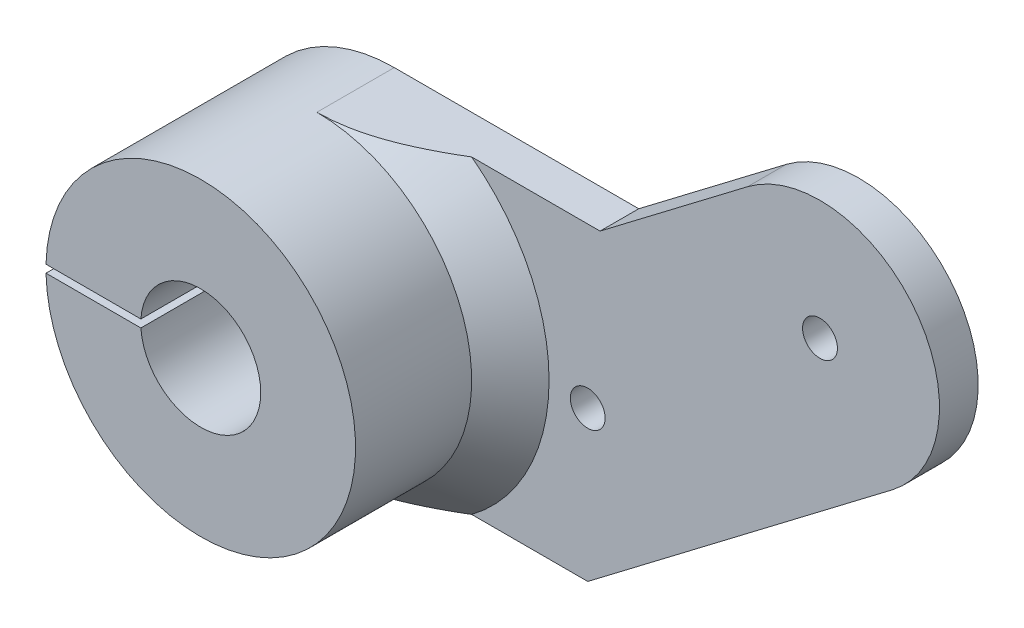
ISO-10303-21;
HEADER;
FILE_DESCRIPTION(('STEP AP214'),'2;1');
FILE_NAME('part.step','',(''),(''),'','','');
FILE_SCHEMA(('AUTOMOTIVE_DESIGN { 1 0 10303 214 1 1 1 1 }'));
ENDSEC;
DATA;
#1=APPLICATION_CONTEXT('core data for automotive mechanical design processes');
#2=APPLICATION_PROTOCOL_DEFINITION('international standard','automotive_design',2000,#1);
#3=PRODUCT_CONTEXT('',#1,'mechanical');
#4=PRODUCT('Part','Part','',(#3));
#5=PRODUCT_RELATED_PRODUCT_CATEGORY('part','',(#4));
#6=PRODUCT_DEFINITION_FORMATION('','',#4);
#7=PRODUCT_DEFINITION_CONTEXT('part definition',#1,'design');
#8=PRODUCT_DEFINITION('design','',#6,#7);
#9=PRODUCT_DEFINITION_SHAPE('','',#8);
#10=(LENGTH_UNIT() NAMED_UNIT(*) SI_UNIT(.MILLI.,.METRE.));
#11=(NAMED_UNIT(*) PLANE_ANGLE_UNIT() SI_UNIT($,.RADIAN.));
#12=(NAMED_UNIT(*) SI_UNIT($,.STERADIAN.) SOLID_ANGLE_UNIT());
#13=UNCERTAINTY_MEASURE_WITH_UNIT(LENGTH_MEASURE(1.E-05),#10,'distance_accuracy_value','');
#14=(GEOMETRIC_REPRESENTATION_CONTEXT(3) GLOBAL_UNCERTAINTY_ASSIGNED_CONTEXT((#13)) GLOBAL_UNIT_ASSIGNED_CONTEXT((#10,
#11,#12)) REPRESENTATION_CONTEXT('',''));
#15=CARTESIAN_POINT('',(0.,0.,0.));
#16=DIRECTION('',(0.,0.,1.));
#17=DIRECTION('',(1.,0.,0.));
#18=AXIS2_PLACEMENT_3D('',#15,#16,#17);
#19=CARTESIAN_POINT('',(0.,0.,5.));
#20=DIRECTION('',(0.,0.,1.));
#21=DIRECTION('',(1.,0.,0.));
#22=AXIS2_PLACEMENT_3D('',#19,#20,#21);
#23=PLANE('',#22);
#24=DIRECTION('',(-1.,0.,0.));
#25=VECTOR('',#24,1.);
#26=CARTESIAN_POINT('',(0.,20.,5.));
#27=LINE('',#26,#25);
#28=CARTESIAN_POINT('',(31.5884611738769,20.,5.));
#29=VERTEX_POINT('',#28);
#30=CARTESIAN_POINT('',(14.9999999999999,20.,5.));
#31=VERTEX_POINT('',#30);
#32=EDGE_CURVE('E175',#29,#31,#27,.T.);
#33=ORIENTED_EDGE('',*,*,#32,.T.);
#34=CARTESIAN_POINT('',(0.,0.,5.));
#35=DIRECTION('',(0.,0.,1.));
#36=DIRECTION('',(1.,0.,0.));
#37=AXIS2_PLACEMENT_3D('',#34,#35,#36);
#38=CIRCLE('',#37,25.);
#39=CARTESIAN_POINT('',(14.9999999999999,-20.,5.));
#40=VERTEX_POINT('',#39);
#41=EDGE_CURVE('E59',#31,#40,#38,.F.);
#42=ORIENTED_EDGE('',*,*,#41,.T.);
#43=DIRECTION('',(1.,0.,0.));
#44=VECTOR('',#43,1.);
#45=CARTESIAN_POINT('',(30.,-20.,5.));
#46=LINE('',#45,#44);
#47=CARTESIAN_POINT('',(30.,-20.,5.));
#48=VERTEX_POINT('',#47);
#49=EDGE_CURVE('E166',#40,#48,#46,.T.);
#50=ORIENTED_EDGE('',*,*,#49,.T.);
#51=DIRECTION('',(0.795919846865735,0.605402013017156,0.));
#52=VECTOR('',#51,1.);
#53=CARTESIAN_POINT('',(69.3459347940942,9.92777252909064,5.));
#54=LINE('',#53,#52);
#55=CARTESIAN_POINT('',(69.3459347940942,9.92777252909065,5.));
#56=VERTEX_POINT('',#55);
#57=EDGE_CURVE('E168',#48,#56,#54,.T.);
#58=ORIENTED_EDGE('',*,*,#57,.T.);
#59=CARTESIAN_POINT('',(59.9999999653329,22.2148393999999,5.));
#60=DIRECTION('',(0.,0.,1.));
#61=DIRECTION('',(-1.,0.,0.));
#62=AXIS2_PLACEMENT_3D('',#59,#60,#61);
#63=CIRCLE('',#62,15.4375681411824);
#64=CARTESIAN_POINT('',(50.6540651365716,34.5019062709091,5.));
#65=VERTEX_POINT('',#64);
#66=EDGE_CURVE('E171',#56,#65,#63,.T.);
#67=ORIENTED_EDGE('',*,*,#66,.T.);
#68=DIRECTION('',(-0.795919846865736,-0.605402013017156,0.));
#69=VECTOR('',#68,1.);
#70=CARTESIAN_POINT('',(31.5884611738769,20.,5.));
#71=LINE('',#70,#69);
#72=EDGE_CURVE('E173',#65,#29,#71,.T.);
#73=ORIENTED_EDGE('',*,*,#72,.T.);
#74=EDGE_LOOP('',(#33,#42,#50,#58,#67,#73));
#75=FACE_BOUND('',#74,.T.);
#76=CARTESIAN_POINT('',(29.9938217384947,-0.608816490746889,5.));
#77=DIRECTION('',(0.,0.,1.));
#78=DIRECTION('',(1.,0.,0.));
#79=AXIS2_PLACEMENT_3D('',#76,#77,#78);
#80=CIRCLE('',#79,2.25000000000001);
#81=CARTESIAN_POINT('',(32.2438217384947,-0.608816490746889,5.));
#82=VERTEX_POINT('',#81);
#83=EDGE_CURVE('E160',#82,#82,#80,.T.);
#84=ORIENTED_EDGE('',*,*,#83,.F.);
#85=EDGE_LOOP('',(#84));
#86=FACE_BOUND('',#85,.T.);
#87=CARTESIAN_POINT('',(59.9999999653329,22.2148393999999,5.));
#88=DIRECTION('',(0.,0.,1.));
#89=DIRECTION('',(1.,0.,0.));
#90=AXIS2_PLACEMENT_3D('',#87,#88,#89);
#91=CIRCLE('',#90,2.24999999999999);
#92=CARTESIAN_POINT('',(62.2499999653329,22.2148393999999,5.));
#93=VERTEX_POINT('',#92);
#94=EDGE_CURVE('E154',#93,#93,#91,.T.);
#95=ORIENTED_EDGE('',*,*,#94,.F.);
#96=EDGE_LOOP('',(#95));
#97=FACE_BOUND('',#96,.T.);
#98=ADVANCED_FACE('F33',(#75,#86,#97),#23,.T.);
#99=CARTESIAN_POINT('',(0.,0.,0.));
#100=DIRECTION('',(0.,0.,1.));
#101=DIRECTION('',(1.,0.,0.));
#102=AXIS2_PLACEMENT_3D('',#99,#100,#101);
#103=PLANE('',#102);
#104=CARTESIAN_POINT('',(0.,0.,0.));
#105=DIRECTION('',(0.,0.,-1.));
#106=DIRECTION('',(1.,0.,0.));
#107=AXIS2_PLACEMENT_3D('',#104,#105,#106);
#108=CIRCLE('',#107,7.75);
#109=CARTESIAN_POINT('',(-7.73385414912901,0.499999999999999,0.));
#110=VERTEX_POINT('',#109);
#111=CARTESIAN_POINT('',(-7.73385414912901,-0.500000000000001,0.));
#112=VERTEX_POINT('',#111);
#113=EDGE_CURVE('E163',#110,#112,#108,.T.);
#114=ORIENTED_EDGE('',*,*,#113,.F.);
#115=DIRECTION('',(1.,0.,0.));
#116=VECTOR('',#115,1.);
#117=CARTESIAN_POINT('',(-7.73385414912901,0.499999999999999,0.));
#118=LINE('',#117,#116);
#119=CARTESIAN_POINT('',(-19.9937490231322,0.499999999999997,0.));
#120=VERTEX_POINT('',#119);
#121=EDGE_CURVE('E169',#120,#110,#118,.T.);
#122=ORIENTED_EDGE('',*,*,#121,.F.);
#123=CARTESIAN_POINT('',(0.,0.,0.));
#124=DIRECTION('',(0.,0.,1.));
#125=DIRECTION('',(1.,0.,0.));
#126=AXIS2_PLACEMENT_3D('',#123,#124,#125);
#127=CIRCLE('',#126,20.);
#128=CARTESIAN_POINT('',(0.,20.,0.));
#129=VERTEX_POINT('',#128);
#130=EDGE_CURVE('E131',#129,#120,#127,.T.);
#131=ORIENTED_EDGE('',*,*,#130,.F.);
#132=DIRECTION('',(-1.,0.,0.));
#133=VECTOR('',#132,1.);
#134=CARTESIAN_POINT('',(0.,20.,0.));
#135=LINE('',#134,#133);
#136=CARTESIAN_POINT('',(31.5884611738769,20.,0.));
#137=VERTEX_POINT('',#136);
#138=EDGE_CURVE('E191',#137,#129,#135,.T.);
#139=ORIENTED_EDGE('',*,*,#138,.F.);
#140=DIRECTION('',(-0.795919846865736,-0.605402013017156,0.));
#141=VECTOR('',#140,1.);
#142=CARTESIAN_POINT('',(31.5884611738769,20.,0.));
#143=LINE('',#142,#141);
#144=CARTESIAN_POINT('',(50.6540651365716,34.5019062709091,0.));
#145=VERTEX_POINT('',#144);
#146=EDGE_CURVE('E189',#145,#137,#143,.T.);
#147=ORIENTED_EDGE('',*,*,#146,.F.);
#148=CARTESIAN_POINT('',(59.9999999653329,22.2148393999999,0.));
#149=DIRECTION('',(0.,0.,1.));
#150=DIRECTION('',(-1.,0.,0.));
#151=AXIS2_PLACEMENT_3D('',#148,#149,#150);
#152=CIRCLE('',#151,15.4375681411824);
#153=CARTESIAN_POINT('',(69.3459347940942,9.92777252909065,0.));
#154=VERTEX_POINT('',#153);
#155=EDGE_CURVE('E187',#154,#145,#152,.T.);
#156=ORIENTED_EDGE('',*,*,#155,.F.);
#157=DIRECTION('',(0.795919846865735,0.605402013017156,0.));
#158=VECTOR('',#157,1.);
#159=CARTESIAN_POINT('',(69.3459347940942,9.92777252909064,0.));
#160=LINE('',#159,#158);
#161=CARTESIAN_POINT('',(30.,-20.,0.));
#162=VERTEX_POINT('',#161);
#163=EDGE_CURVE('E185',#162,#154,#160,.T.);
#164=ORIENTED_EDGE('',*,*,#163,.F.);
#165=DIRECTION('',(1.,0.,0.));
#166=VECTOR('',#165,1.);
#167=CARTESIAN_POINT('',(30.,-20.,0.));
#168=LINE('',#167,#166);
#169=CARTESIAN_POINT('',(0.,-20.,0.));
#170=VERTEX_POINT('',#169);
#171=EDGE_CURVE('E183',#170,#162,#168,.T.);
#172=ORIENTED_EDGE('',*,*,#171,.F.);
#173=CARTESIAN_POINT('',(0.,0.,0.));
#174=DIRECTION('',(0.,0.,1.));
#175=DIRECTION('',(1.,0.,0.));
#176=AXIS2_PLACEMENT_3D('',#173,#174,#175);
#177=CIRCLE('',#176,20.);
#178=CARTESIAN_POINT('',(-19.9937490231322,-0.499999999999995,0.));
#179=VERTEX_POINT('',#178);
#180=EDGE_CURVE('E181',#179,#170,#177,.T.);
#181=ORIENTED_EDGE('',*,*,#180,.F.);
#182=DIRECTION('',(-1.,0.,0.));
#183=VECTOR('',#182,1.);
#184=CARTESIAN_POINT('',(-7.73385414912901,-0.500000000000001,0.));
#185=LINE('',#184,#183);
#186=EDGE_CURVE('E179',#112,#179,#185,.T.);
#187=ORIENTED_EDGE('',*,*,#186,.F.);
#188=EDGE_LOOP('',(#114,#122,#131,#139,#147,#156,#164,#172,#181,#187));
#189=FACE_BOUND('',#188,.T.);
#190=CARTESIAN_POINT('',(29.9938217384947,-0.608816490746889,0.));
#191=DIRECTION('',(0.,0.,1.));
#192=DIRECTION('',(1.,0.,0.));
#193=AXIS2_PLACEMENT_3D('',#190,#191,#192);
#194=CIRCLE('',#193,2.25000000000001);
#195=CARTESIAN_POINT('',(32.2438217384947,-0.608816490746889,0.));
#196=VERTEX_POINT('',#195);
#197=EDGE_CURVE('E157',#196,#196,#194,.T.);
#198=ORIENTED_EDGE('',*,*,#197,.T.);
#199=EDGE_LOOP('',(#198));
#200=FACE_BOUND('',#199,.T.);
#201=CARTESIAN_POINT('',(59.9999999653329,22.2148393999999,0.));
#202=DIRECTION('',(0.,0.,1.));
#203=DIRECTION('',(1.,0.,0.));
#204=AXIS2_PLACEMENT_3D('',#201,#202,#203);
#205=CIRCLE('',#204,2.24999999999999);
#206=CARTESIAN_POINT('',(62.2499999653329,22.2148393999999,0.));
#207=VERTEX_POINT('',#206);
#208=EDGE_CURVE('E153',#207,#207,#205,.T.);
#209=ORIENTED_EDGE('',*,*,#208,.T.);
#210=EDGE_LOOP('',(#209));
#211=FACE_BOUND('',#210,.T.);
#212=ADVANCED_FACE('F250',(#189,#200,#211),#103,.F.);
#213=CARTESIAN_POINT('',(0.,0.,5.));
#214=DIRECTION('',(0.,0.,-1.));
#215=DIRECTION('',(-1.,0.,0.));
#216=AXIS2_PLACEMENT_3D('',#213,#214,#215);
#217=CYLINDRICAL_SURFACE('',#216,7.75);
#218=ORIENTED_EDGE('',*,*,#113,.T.);
#219=DIRECTION('',(0.,0.,-1.));
#220=VECTOR('',#219,1.);
#221=CARTESIAN_POINT('',(-7.73385414912901,-0.500000000000001,5.));
#222=LINE('',#221,#220);
#223=CARTESIAN_POINT('',(-7.73385414912901,-0.5,25.));
#224=VERTEX_POINT('',#223);
#225=EDGE_CURVE('E214',#224,#112,#222,.T.);
#226=ORIENTED_EDGE('',*,*,#225,.F.);
#227=CARTESIAN_POINT('',(0.,0.,25.));
#228=DIRECTION('',(0.,0.,-1.));
#229=DIRECTION('',(1.,0.,0.));
#230=AXIS2_PLACEMENT_3D('',#227,#228,#229);
#231=CIRCLE('',#230,7.75);
#232=CARTESIAN_POINT('',(-7.73385414912901,0.499999999999995,25.));
#233=VERTEX_POINT('',#232);
#234=EDGE_CURVE('E144',#233,#224,#231,.T.);
#235=ORIENTED_EDGE('',*,*,#234,.F.);
#236=DIRECTION('',(0.,0.,-1.));
#237=VECTOR('',#236,1.);
#238=CARTESIAN_POINT('',(-7.73385414912901,0.499999999999999,5.));
#239=LINE('',#238,#237);
#240=EDGE_CURVE('E135',#233,#110,#239,.T.);
#241=ORIENTED_EDGE('',*,*,#240,.T.);
#242=EDGE_LOOP('',(#218,#226,#235,#241));
#243=FACE_BOUND('',#242,.T.);
#244=ADVANCED_FACE('F247',(#243),#217,.F.);
#245=CARTESIAN_POINT('',(-7.73385414912901,-0.500000000000001,5.));
#246=DIRECTION('',(0.,-1.,0.));
#247=DIRECTION('',(1.,0.,0.));
#248=AXIS2_PLACEMENT_3D('',#245,#246,#247);
#249=PLANE('',#248);
#250=ORIENTED_EDGE('',*,*,#186,.T.);
#251=DIRECTION('',(0.,0.,-1.));
#252=VECTOR('',#251,1.);
#253=CARTESIAN_POINT('',(-19.9937490231322,-0.499999999999995,5.));
#254=LINE('',#253,#252);
#255=CARTESIAN_POINT('',(-19.9937490231322,-0.499999999999977,25.));
#256=VERTEX_POINT('',#255);
#257=EDGE_CURVE('E212',#256,#179,#254,.T.);
#258=ORIENTED_EDGE('',*,*,#257,.F.);
#259=DIRECTION('',(-1.,0.,0.));
#260=VECTOR('',#259,1.);
#261=CARTESIAN_POINT('',(-7.73385414912901,-0.5,25.));
#262=LINE('',#261,#260);
#263=EDGE_CURVE('E148',#224,#256,#262,.T.);
#264=ORIENTED_EDGE('',*,*,#263,.F.);
#265=ORIENTED_EDGE('',*,*,#225,.T.);
#266=EDGE_LOOP('',(#250,#258,#264,#265));
#267=FACE_BOUND('',#266,.T.);
#268=ADVANCED_FACE('F244',(#267),#249,.F.);
#269=CARTESIAN_POINT('',(30.,-20.,5.));
#270=DIRECTION('',(0.,1.,0.));
#271=DIRECTION('',(-1.,0.,0.));
#272=AXIS2_PLACEMENT_3D('',#269,#270,#271);
#273=PLANE('',#272);
#274=ORIENTED_EDGE('',*,*,#171,.T.);
#275=DIRECTION('',(0.,0.,-1.));
#276=VECTOR('',#275,1.);
#277=CARTESIAN_POINT('',(30.,-20.,5.));
#278=LINE('',#277,#276);
#279=EDGE_CURVE('E206',#48,#162,#278,.T.);
#280=ORIENTED_EDGE('',*,*,#279,.F.);
#281=ORIENTED_EDGE('',*,*,#49,.F.);
#282=CARTESIAN_POINT('',(14.9999999999999,-20.,5.));
#283=CARTESIAN_POINT('',(14.6381576045713,-20.,5.21707649757528));
#284=CARTESIAN_POINT('',(14.2740980353937,-20.,5.43051201900156));
#285=CARTESIAN_POINT('',(13.5410890136851,-20.,5.84901353375797));
#286=CARTESIAN_POINT('',(13.1721384090418,-20.,6.05407750698748));
#287=CARTESIAN_POINT('',(12.4277741577037,-20.,6.45533897441184));
#288=CARTESIAN_POINT('',(12.0523425094619,-20.,6.651503187163));
#289=CARTESIAN_POINT('',(11.2959465698523,-20.,7.03281261264192));
#290=CARTESIAN_POINT('',(10.9149826683314,-20.,7.21795859716003));
#291=CARTESIAN_POINT('',(10.157014751715,-20.,7.57110249325882));
#292=CARTESIAN_POINT('',(9.7801597543341,-20.,7.73941841374451));
#293=CARTESIAN_POINT('',(9.02068327631624,-20.,8.06248548865935));
#294=CARTESIAN_POINT('',(8.63806137846008,-20.,8.21723565606984));
#295=CARTESIAN_POINT('',(7.48230333151897,-20.,8.65805870685982));
#296=CARTESIAN_POINT('',(6.7000901060677,-20.,8.92126772817135));
#297=CARTESIAN_POINT('',(5.43059918331015,-20.,9.28086637815952));
#298=CARTESIAN_POINT('',(4.95022478477442,-20.,9.40190678522479));
#299=CARTESIAN_POINT('',(3.98259104409489,-20.,9.6127885497784));
#300=CARTESIAN_POINT('',(3.49533257722456,-20.,9.7026338370666));
#301=CARTESIAN_POINT('',(2.75705336480795,-20.,9.81236025011989));
#302=CARTESIAN_POINT('',(2.50786169783125,-20.,9.84490705858015));
#303=CARTESIAN_POINT('',(2.00845214223114,-20.,9.90093674978071));
#304=CARTESIAN_POINT('',(1.75823426993727,-20.,9.92441977618761));
#305=CARTESIAN_POINT('',(1.25686885764872,-20.,9.96210559440869));
#306=CARTESIAN_POINT('',(1.00572067301609,-20.,9.97629980608933));
#307=CARTESIAN_POINT('',(0.503050059737094,-20.,9.99525544398784));
#308=CARTESIAN_POINT('',(0.251527604009808,-20.,10.0000161507329));
#309=CARTESIAN_POINT('',(0.,-20.,10.));
#310=B_SPLINE_CURVE_WITH_KNOTS('',3,(#282,#283,#284,#285,#286,#287,#288,#289,#290,#291,#292,
#293,#294,#295,#296,#297,#298,#299,#300,#301,#302,#303,#304,#305,#306,#307,#308,#309),
.UNSPECIFIED.,.F.,.F.,(4,2,2,2,2,2,2,2,2,2,2,2,2,4),(0.,1.26590685788355,2.53211740191926,
3.80272730826572,5.07324810758739,6.31118460802035,7.54921110375582,10.0213373057573,
11.5066840353459,12.9918435806868,13.7456317110507,14.4994078929113,15.2538793631991,
16.0084083731613),.UNSPECIFIED.);
#311=CARTESIAN_POINT('',(0.,-20.,10.));
#312=VERTEX_POINT('',#311);
#313=EDGE_CURVE('E11',#40,#312,#310,.T.);
#314=ORIENTED_EDGE('',*,*,#313,.T.);
#315=DIRECTION('',(0.,0.,-1.));
#316=VECTOR('',#315,1.);
#317=CARTESIAN_POINT('',(0.,-20.,5.));
#318=LINE('',#317,#316);
#319=EDGE_CURVE('E209',#312,#170,#318,.T.);
#320=ORIENTED_EDGE('',*,*,#319,.T.);
#321=EDGE_LOOP('',(#274,#280,#281,#314,#320));
#322=FACE_BOUND('',#321,.T.);
#323=ADVANCED_FACE('F239',(#322),#273,.F.);
#324=CARTESIAN_POINT('',(69.3459347940942,9.92777252909064,5.));
#325=DIRECTION('',(-0.605402013017156,0.795919846865735,0.));
#326=DIRECTION('',(-0.795919846865736,-0.605402013017156,0.));
#327=AXIS2_PLACEMENT_3D('',#324,#325,#326);
#328=PLANE('',#327);
#329=ORIENTED_EDGE('',*,*,#163,.T.);
#330=DIRECTION('',(0.,0.,-1.));
#331=VECTOR('',#330,1.);
#332=CARTESIAN_POINT('',(69.3459347940942,9.92777252909065,5.));
#333=LINE('',#332,#331);
#334=EDGE_CURVE('E203',#56,#154,#333,.T.);
#335=ORIENTED_EDGE('',*,*,#334,.F.);
#336=ORIENTED_EDGE('',*,*,#57,.F.);
#337=ORIENTED_EDGE('',*,*,#279,.T.);
#338=EDGE_LOOP('',(#329,#335,#336,#337));
#339=FACE_BOUND('',#338,.T.);
#340=ADVANCED_FACE('F236',(#339),#328,.F.);
#341=CARTESIAN_POINT('',(59.9999999653329,22.2148393999999,5.));
#342=DIRECTION('',(0.,0.,-1.));
#343=DIRECTION('',(-1.,0.,0.));
#344=AXIS2_PLACEMENT_3D('',#341,#342,#343);
#345=CYLINDRICAL_SURFACE('',#344,15.4375681411824);
#346=ORIENTED_EDGE('',*,*,#155,.T.);
#347=DIRECTION('',(0.,0.,-1.));
#348=VECTOR('',#347,1.);
#349=CARTESIAN_POINT('',(50.6540651365716,34.5019062709091,5.));
#350=LINE('',#349,#348);
#351=EDGE_CURVE('E200',#65,#145,#350,.T.);
#352=ORIENTED_EDGE('',*,*,#351,.F.);
#353=ORIENTED_EDGE('',*,*,#66,.F.);
#354=ORIENTED_EDGE('',*,*,#334,.T.);
#355=EDGE_LOOP('',(#346,#352,#353,#354));
#356=FACE_BOUND('',#355,.T.);
#357=ADVANCED_FACE('F232',(#356),#345,.T.);
#358=CARTESIAN_POINT('',(31.5884611738769,20.,5.));
#359=DIRECTION('',(0.605402013017156,-0.795919846865736,0.));
#360=DIRECTION('',(0.795919846865736,0.605402013017156,0.));
#361=AXIS2_PLACEMENT_3D('',#358,#359,#360);
#362=PLANE('',#361);
#363=ORIENTED_EDGE('',*,*,#146,.T.);
#364=DIRECTION('',(0.,0.,-1.));
#365=VECTOR('',#364,1.);
#366=CARTESIAN_POINT('',(31.5884611738769,20.,5.));
#367=LINE('',#366,#365);
#368=EDGE_CURVE('E197',#29,#137,#367,.T.);
#369=ORIENTED_EDGE('',*,*,#368,.F.);
#370=ORIENTED_EDGE('',*,*,#72,.F.);
#371=ORIENTED_EDGE('',*,*,#351,.T.);
#372=EDGE_LOOP('',(#363,#369,#370,#371));
#373=FACE_BOUND('',#372,.T.);
#374=ADVANCED_FACE('F228',(#373),#362,.F.);
#375=CARTESIAN_POINT('',(0.,20.,5.));
#376=DIRECTION('',(0.,-1.,0.));
#377=DIRECTION('',(1.,0.,0.));
#378=AXIS2_PLACEMENT_3D('',#375,#376,#377);
#379=PLANE('',#378);
#380=ORIENTED_EDGE('',*,*,#138,.T.);
#381=DIRECTION('',(0.,0.,-1.));
#382=VECTOR('',#381,1.);
#383=CARTESIAN_POINT('',(0.,20.,5.));
#384=LINE('',#383,#382);
#385=CARTESIAN_POINT('',(0.,20.,10.));
#386=VERTEX_POINT('',#385);
#387=EDGE_CURVE('E134',#386,#129,#384,.T.);
#388=ORIENTED_EDGE('',*,*,#387,.F.);
#389=CARTESIAN_POINT('',(0.,20.,10.));
#390=CARTESIAN_POINT('',(0.307426194986437,20.,10.0000357749711));
#391=CARTESIAN_POINT('',(0.614840078132581,20.,9.99291262944521));
#392=CARTESIAN_POINT('',(1.228972450013,20.,9.96461436358608));
#393=CARTESIAN_POINT('',(1.53569104300671,20.,9.94344151215551));
#394=CARTESIAN_POINT('',(2.14727972664351,20.,9.8873629078503));
#395=CARTESIAN_POINT('',(2.45215222317967,20.,9.85248334401371));
#396=CARTESIAN_POINT('',(3.06007844956625,20.,9.76949432965097));
#397=CARTESIAN_POINT('',(3.36313212196023,20.,9.72138446340556));
#398=CARTESIAN_POINT('',(4.25874591705681,20.,9.55993337303414));
#399=CARTESIAN_POINT('',(4.84811331981963,20.,9.42847824913806));
#400=CARTESIAN_POINT('',(6.01558512597729,20.,9.12251762265332));
#401=CARTESIAN_POINT('',(6.59368477749272,20.,8.94799436365674));
#402=CARTESIAN_POINT('',(7.84575048636558,20.,8.52569783492918));
#403=CARTESIAN_POINT('',(8.51713416430885,20.,8.27031147706576));
#404=CARTESIAN_POINT('',(9.84251119240265,20.,7.7174563915097));
#405=CARTESIAN_POINT('',(10.4964958920851,20.,7.4199671789298));
#406=CARTESIAN_POINT('',(11.471925731907,20.,6.94523256108797));
#407=CARTESIAN_POINT('',(11.7994964393425,20.,6.78038210628803));
#408=CARTESIAN_POINT('',(12.4505962192897,20.,6.44283953149165));
#409=CARTESIAN_POINT('',(12.7741251337481,20.,6.27014710605326));
#410=CARTESIAN_POINT('',(13.4167947857014,20.,5.91809402488513));
#411=CARTESIAN_POINT('',(13.735942140825,20.,5.7387454095382));
#412=CARTESIAN_POINT('',(14.3706149690108,20.,5.37384769971776));
#413=CARTESIAN_POINT('',(14.6861409486221,20.,5.18829948698684));
#414=CARTESIAN_POINT('',(14.9999999999999,20.,5.));
#415=B_SPLINE_CURVE_WITH_KNOTS('',3,(#389,#390,#391,#392,#393,#394,#395,#396,#397,#398,#399,
#400,#401,#402,#403,#404,#405,#406,#407,#408,#409,#410,#411,#412,#413,#414),.UNSPECIFIED.,.F.,
.F.,(4,2,2,2,2,2,2,2,2,2,2,2,4),(0.,0.922175637516719,1.84420238809386,2.76447594677464,
3.68477842536604,5.49427836293858,7.30452558284451,9.45765829492117,11.6118422252129,
12.7118955016526,13.8119916615863,14.9101865488714,16.0082259038792),.UNSPECIFIED.);
#416=EDGE_CURVE('E46',#386,#31,#415,.T.);
#417=ORIENTED_EDGE('',*,*,#416,.T.);
#418=ORIENTED_EDGE('',*,*,#32,.F.);
#419=ORIENTED_EDGE('',*,*,#368,.T.);
#420=EDGE_LOOP('',(#380,#388,#417,#418,#419));
#421=FACE_BOUND('',#420,.T.);
#422=ADVANCED_FACE('F223',(#421),#379,.F.);
#423=CARTESIAN_POINT('',(0.,0.,5.));
#424=DIRECTION('',(0.,0.,-1.));
#425=DIRECTION('',(-1.,0.,0.));
#426=AXIS2_PLACEMENT_3D('',#423,#424,#425);
#427=CYLINDRICAL_SURFACE('',#426,20.);
#428=CARTESIAN_POINT('',(0.,0.,10.));
#429=DIRECTION('',(0.,0.,1.));
#430=DIRECTION('',(1.,0.,0.));
#431=AXIS2_PLACEMENT_3D('',#428,#429,#430);
#432=CIRCLE('',#431,20.);
#433=EDGE_CURVE('E217',#312,#386,#432,.T.);
#434=ORIENTED_EDGE('',*,*,#433,.T.);
#435=ORIENTED_EDGE('',*,*,#387,.T.);
#436=ORIENTED_EDGE('',*,*,#130,.T.);
#437=DIRECTION('',(0.,0.,-1.));
#438=VECTOR('',#437,1.);
#439=CARTESIAN_POINT('',(-19.9937490231322,0.499999999999997,5.));
#440=LINE('',#439,#438);
#441=CARTESIAN_POINT('',(-19.9937490231322,0.499999999999997,25.));
#442=VERTEX_POINT('',#441);
#443=EDGE_CURVE('E121',#442,#120,#440,.T.);
#444=ORIENTED_EDGE('',*,*,#443,.F.);
#445=CARTESIAN_POINT('',(0.,0.,25.));
#446=DIRECTION('',(0.,0.,1.));
#447=DIRECTION('',(1.,0.,0.));
#448=AXIS2_PLACEMENT_3D('',#445,#446,#447);
#449=CIRCLE('',#448,20.);
#450=EDGE_CURVE('E127',#256,#442,#449,.T.);
#451=ORIENTED_EDGE('',*,*,#450,.F.);
#452=ORIENTED_EDGE('',*,*,#257,.T.);
#453=ORIENTED_EDGE('',*,*,#180,.T.);
#454=ORIENTED_EDGE('',*,*,#319,.F.);
#455=EDGE_LOOP('',(#434,#435,#436,#444,#451,#452,#453,#454));
#456=FACE_BOUND('',#455,.T.);
#457=ADVANCED_FACE('F124',(#456),#427,.T.);
#458=CARTESIAN_POINT('',(-7.73385414912901,0.499999999999999,5.));
#459=DIRECTION('',(0.,1.,0.));
#460=DIRECTION('',(-1.,0.,0.));
#461=AXIS2_PLACEMENT_3D('',#458,#459,#460);
#462=PLANE('',#461);
#463=ORIENTED_EDGE('',*,*,#121,.T.);
#464=ORIENTED_EDGE('',*,*,#240,.F.);
#465=DIRECTION('',(1.,0.,0.));
#466=VECTOR('',#465,1.);
#467=CARTESIAN_POINT('',(-19.9937490231322,0.499999999999997,25.));
#468=LINE('',#467,#466);
#469=EDGE_CURVE('E138',#442,#233,#468,.T.);
#470=ORIENTED_EDGE('',*,*,#469,.F.);
#471=ORIENTED_EDGE('',*,*,#443,.T.);
#472=EDGE_LOOP('',(#463,#464,#470,#471));
#473=FACE_BOUND('',#472,.T.);
#474=ADVANCED_FACE('F139',(#473),#462,.F.);
#475=CARTESIAN_POINT('',(29.9938217384947,-0.608816490746889,5.));
#476=DIRECTION('',(0.,0.,-1.));
#477=DIRECTION('',(-1.,0.,0.));
#478=AXIS2_PLACEMENT_3D('',#475,#476,#477);
#479=CYLINDRICAL_SURFACE('',#478,2.25000000000001);
#480=ORIENTED_EDGE('',*,*,#83,.T.);
#481=EDGE_LOOP('',(#480));
#482=FACE_BOUND('',#481,.T.);
#483=ORIENTED_EDGE('',*,*,#197,.F.);
#484=EDGE_LOOP('',(#483));
#485=FACE_BOUND('',#484,.T.);
#486=ADVANCED_FACE('F263',(#482,#485),#479,.F.);
#487=CARTESIAN_POINT('',(59.9999999653329,22.2148393999999,5.));
#488=DIRECTION('',(0.,0.,-1.));
#489=DIRECTION('',(-1.,0.,0.));
#490=AXIS2_PLACEMENT_3D('',#487,#488,#489);
#491=CYLINDRICAL_SURFACE('',#490,2.24999999999999);
#492=ORIENTED_EDGE('',*,*,#94,.T.);
#493=EDGE_LOOP('',(#492));
#494=FACE_BOUND('',#493,.T.);
#495=ORIENTED_EDGE('',*,*,#208,.F.);
#496=EDGE_LOOP('',(#495));
#497=FACE_BOUND('',#496,.T.);
#498=ADVANCED_FACE('F270',(#494,#497),#491,.F.);
#499=CARTESIAN_POINT('',(0.,0.,25.));
#500=DIRECTION('',(0.,0.,1.));
#501=DIRECTION('',(1.,0.,0.));
#502=AXIS2_PLACEMENT_3D('',#499,#500,#501);
#503=PLANE('',#502);
#504=ORIENTED_EDGE('',*,*,#450,.T.);
#505=ORIENTED_EDGE('',*,*,#469,.T.);
#506=ORIENTED_EDGE('',*,*,#234,.T.);
#507=ORIENTED_EDGE('',*,*,#263,.T.);
#508=EDGE_LOOP('',(#504,#505,#506,#507));
#509=FACE_BOUND('',#508,.T.);
#510=ADVANCED_FACE('F146',(#509),#503,.T.);
#511=CARTESIAN_POINT('',(0.,0.,10.));
#512=DIRECTION('',(0.,0.,-1.));
#513=DIRECTION('',(-1.,0.,0.));
#514=AXIS2_PLACEMENT_3D('',#511,#512,#513);
#515=CONICAL_SURFACE('',#514,20.,0.785398163397443);
#516=ORIENTED_EDGE('',*,*,#313,.F.);
#517=ORIENTED_EDGE('',*,*,#41,.F.);
#518=ORIENTED_EDGE('',*,*,#416,.F.);
#519=ORIENTED_EDGE('',*,*,#433,.F.);
#520=EDGE_LOOP('',(#516,#517,#518,#519));
#521=FACE_BOUND('',#520,.T.);
#522=ADVANCED_FACE('F35',(#521),#515,.T.);
#523=CLOSED_SHELL('',(#98,#212,#244,#268,#323,#340,#357,#374,#422,#457,#474,#486,#498,#510,#522));
#524=MANIFOLD_SOLID_BREP('B2',#523);
#525=ADVANCED_BREP_SHAPE_REPRESENTATION('',(#18,#524),#14);
#526=SHAPE_DEFINITION_REPRESENTATION(#9,#525);
ENDSEC;
END-ISO-10303-21;
